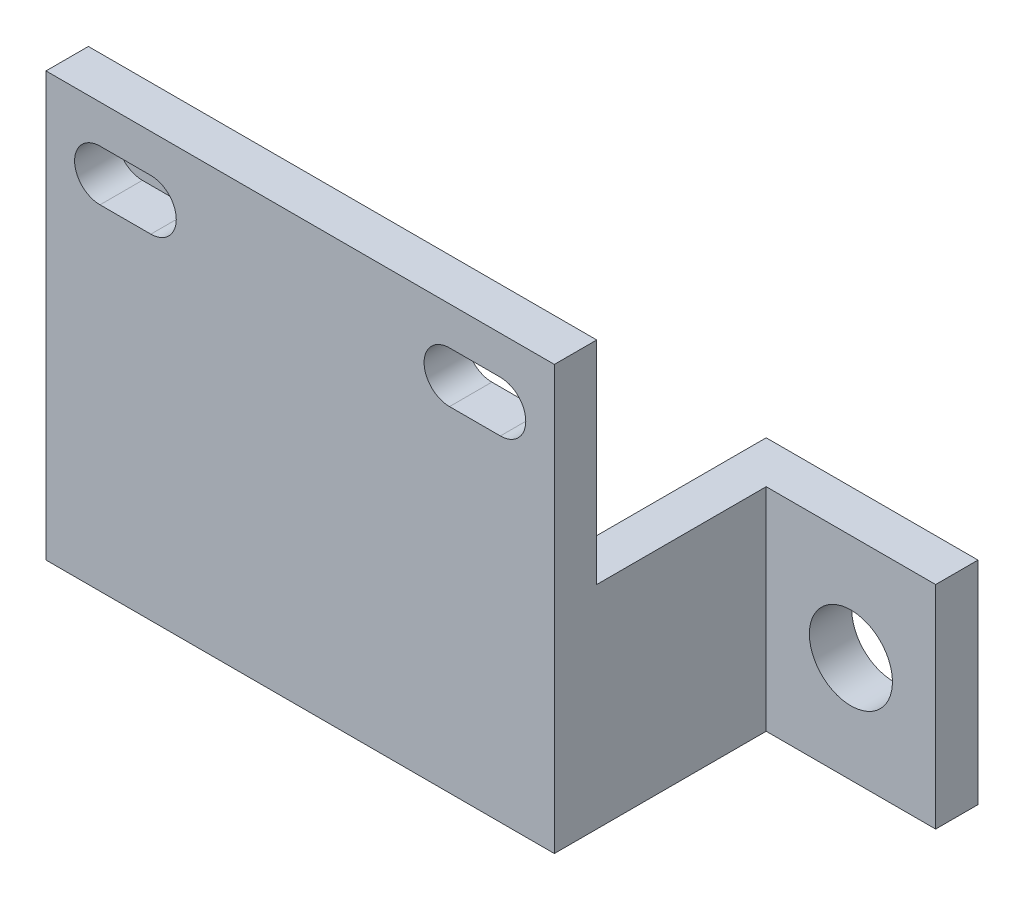
ISO-10303-21;
HEADER;
FILE_DESCRIPTION(('STEP AP214'),'2;1');
FILE_NAME('part.step','',(''),(''),'','','');
FILE_SCHEMA(('AUTOMOTIVE_DESIGN { 1 0 10303 214 1 1 1 1 }'));
ENDSEC;
DATA;
#1=APPLICATION_CONTEXT('core data for automotive mechanical design processes');
#2=APPLICATION_PROTOCOL_DEFINITION('international standard','automotive_design',2000,#1);
#3=PRODUCT_CONTEXT('',#1,'mechanical');
#4=PRODUCT('Part','Part','',(#3));
#5=PRODUCT_RELATED_PRODUCT_CATEGORY('part','',(#4));
#6=PRODUCT_DEFINITION_FORMATION('','',#4);
#7=PRODUCT_DEFINITION_CONTEXT('part definition',#1,'design');
#8=PRODUCT_DEFINITION('design','',#6,#7);
#9=PRODUCT_DEFINITION_SHAPE('','',#8);
#10=(LENGTH_UNIT() NAMED_UNIT(*) SI_UNIT(.MILLI.,.METRE.));
#11=(NAMED_UNIT(*) PLANE_ANGLE_UNIT() SI_UNIT($,.RADIAN.));
#12=(NAMED_UNIT(*) SI_UNIT($,.STERADIAN.) SOLID_ANGLE_UNIT());
#13=UNCERTAINTY_MEASURE_WITH_UNIT(LENGTH_MEASURE(1.E-05),#10,'distance_accuracy_value','');
#14=(GEOMETRIC_REPRESENTATION_CONTEXT(3) GLOBAL_UNCERTAINTY_ASSIGNED_CONTEXT((#13)) GLOBAL_UNIT_ASSIGNED_CONTEXT((#10,
#11,#12)) REPRESENTATION_CONTEXT('',''));
#15=CARTESIAN_POINT('',(0.,0.,0.));
#16=DIRECTION('',(0.,0.,1.));
#17=DIRECTION('',(1.,0.,0.));
#18=AXIS2_PLACEMENT_3D('',#15,#16,#17);
#19=CARTESIAN_POINT('',(-20.32,-6.35,2.54));
#20=DIRECTION('',(0.,0.,1.));
#21=DIRECTION('',(1.,0.,0.));
#22=AXIS2_PLACEMENT_3D('',#19,#20,#21);
#23=CYLINDRICAL_SURFACE('',#22,2.4892);
#24=CARTESIAN_POINT('',(-20.32,-6.35,2.54));
#25=DIRECTION('',(0.,0.,1.));
#26=DIRECTION('',(1.,0.,0.));
#27=AXIS2_PLACEMENT_3D('',#24,#25,#26);
#28=CIRCLE('',#27,2.4892);
#29=CARTESIAN_POINT('',(-17.8308,-6.35,2.54));
#30=VERTEX_POINT('',#29);
#31=EDGE_CURVE('E174',#30,#30,#28,.F.);
#32=ORIENTED_EDGE('',*,*,#31,.F.);
#33=EDGE_LOOP('',(#32));
#34=FACE_BOUND('',#33,.T.);
#35=CARTESIAN_POINT('',(-20.32,-6.35,0.));
#36=DIRECTION('',(0.,0.,1.));
#37=DIRECTION('',(1.,0.,0.));
#38=AXIS2_PLACEMENT_3D('',#35,#36,#37);
#39=CIRCLE('',#38,2.4892);
#40=CARTESIAN_POINT('',(-17.8308,-6.35,0.));
#41=VERTEX_POINT('',#40);
#42=EDGE_CURVE('E231',#41,#41,#39,.F.);
#43=ORIENTED_EDGE('',*,*,#42,.T.);
#44=EDGE_LOOP('',(#43));
#45=FACE_BOUND('',#44,.T.);
#46=ADVANCED_FACE('F16',(#34,#45),#23,.F.);
#47=CARTESIAN_POINT('',(20.32,-6.35,2.54));
#48=DIRECTION('',(0.,0.,-1.));
#49=DIRECTION('',(-1.,0.,0.));
#50=AXIS2_PLACEMENT_3D('',#47,#48,#49);
#51=CYLINDRICAL_SURFACE('',#50,2.4892);
#52=CARTESIAN_POINT('',(20.32,-6.35,2.54));
#53=DIRECTION('',(0.,0.,-1.));
#54=DIRECTION('',(-1.,0.,0.));
#55=AXIS2_PLACEMENT_3D('',#52,#53,#54);
#56=CIRCLE('',#55,2.4892);
#57=CARTESIAN_POINT('',(17.8308,-6.35,2.54));
#58=VERTEX_POINT('',#57);
#59=EDGE_CURVE('E226',#58,#58,#56,.F.);
#60=ORIENTED_EDGE('',*,*,#59,.T.);
#61=EDGE_LOOP('',(#60));
#62=FACE_BOUND('',#61,.T.);
#63=CARTESIAN_POINT('',(20.32,-6.35,0.));
#64=DIRECTION('',(0.,0.,-1.));
#65=DIRECTION('',(-1.,0.,0.));
#66=AXIS2_PLACEMENT_3D('',#63,#64,#65);
#67=CIRCLE('',#66,2.4892);
#68=CARTESIAN_POINT('',(17.8308,-6.35,0.));
#69=VERTEX_POINT('',#68);
#70=EDGE_CURVE('E19',#69,#69,#67,.T.);
#71=ORIENTED_EDGE('',*,*,#70,.T.);
#72=EDGE_LOOP('',(#71));
#73=FACE_BOUND('',#72,.T.);
#74=ADVANCED_FACE('F591',(#62,#73),#51,.F.);
#75=CARTESIAN_POINT('',(0.,0.,0.));
#76=DIRECTION('',(0.,1.,0.));
#77=DIRECTION('',(0.,0.,1.));
#78=AXIS2_PLACEMENT_3D('',#75,#76,#77);
#79=PLANE('',#78);
#80=DIRECTION('',(0.,0.,1.));
#81=VECTOR('',#80,1.);
#82=CARTESIAN_POINT('',(-12.7,0.,0.));
#83=LINE('',#82,#81);
#84=CARTESIAN_POINT('',(-12.7,0.,12.7));
#85=VERTEX_POINT('',#84);
#86=CARTESIAN_POINT('',(-12.7,0.,0.));
#87=VERTEX_POINT('',#86);
#88=EDGE_CURVE('E233',#85,#87,#83,.F.);
#89=ORIENTED_EDGE('',*,*,#88,.T.);
#90=DIRECTION('',(1.,0.,0.));
#91=VECTOR('',#90,1.);
#92=CARTESIAN_POINT('',(0.,0.,0.));
#93=LINE('',#92,#91);
#94=CARTESIAN_POINT('',(-25.4,0.,0.));
#95=VERTEX_POINT('',#94);
#96=EDGE_CURVE('E181',#87,#95,#93,.F.);
#97=ORIENTED_EDGE('',*,*,#96,.T.);
#98=DIRECTION('',(0.,0.,1.));
#99=VECTOR('',#98,1.);
#100=CARTESIAN_POINT('',(-25.4,0.,0.));
#101=LINE('',#100,#99);
#102=CARTESIAN_POINT('',(-25.4,0.,2.54));
#103=VERTEX_POINT('',#102);
#104=EDGE_CURVE('E178',#103,#95,#101,.F.);
#105=ORIENTED_EDGE('',*,*,#104,.F.);
#106=DIRECTION('',(1.,0.,0.));
#107=VECTOR('',#106,1.);
#108=CARTESIAN_POINT('',(0.,0.,2.54));
#109=LINE('',#108,#107);
#110=CARTESIAN_POINT('',(-15.24,0.,2.54));
#111=VERTEX_POINT('',#110);
#112=EDGE_CURVE('E164',#111,#103,#109,.F.);
#113=ORIENTED_EDGE('',*,*,#112,.F.);
#114=DIRECTION('',(0.,0.,-1.));
#115=VECTOR('',#114,1.);
#116=CARTESIAN_POINT('',(-15.24,0.,15.24));
#117=LINE('',#116,#115);
#118=CARTESIAN_POINT('',(-15.24,0.,12.7));
#119=VERTEX_POINT('',#118);
#120=EDGE_CURVE('E277',#111,#119,#117,.F.);
#121=ORIENTED_EDGE('',*,*,#120,.T.);
#122=DIRECTION('',(-1.,0.,0.));
#123=VECTOR('',#122,1.);
#124=CARTESIAN_POINT('',(0.,0.,12.7));
#125=LINE('',#124,#123);
#126=EDGE_CURVE('E271',#85,#119,#125,.T.);
#127=ORIENTED_EDGE('',*,*,#126,.F.);
#128=EDGE_LOOP('',(#89,#97,#105,#113,#121,#127));
#129=FACE_BOUND('',#128,.T.);
#130=ADVANCED_FACE('F179',(#129),#79,.T.);
#131=CARTESIAN_POINT('',(12.7,12.7,0.));
#132=DIRECTION('',(1.,0.,0.));
#133=DIRECTION('',(0.,0.,-1.));
#134=AXIS2_PLACEMENT_3D('',#131,#132,#133);
#135=PLANE('',#134);
#136=DIRECTION('',(0.,0.,-1.));
#137=VECTOR('',#136,1.);
#138=CARTESIAN_POINT('',(12.7,-12.7,0.));
#139=LINE('',#138,#137);
#140=CARTESIAN_POINT('',(12.7,-12.7,12.7));
#141=VERTEX_POINT('',#140);
#142=CARTESIAN_POINT('',(12.7,-12.7,0.));
#143=VERTEX_POINT('',#142);
#144=EDGE_CURVE('E285',#141,#143,#139,.T.);
#145=ORIENTED_EDGE('',*,*,#144,.F.);
#146=DIRECTION('',(0.,1.,0.));
#147=VECTOR('',#146,1.);
#148=CARTESIAN_POINT('',(12.7,0.,12.7));
#149=LINE('',#148,#147);
#150=CARTESIAN_POINT('',(12.7,0.,12.7));
#151=VERTEX_POINT('',#150);
#152=EDGE_CURVE('E265',#151,#141,#149,.F.);
#153=ORIENTED_EDGE('',*,*,#152,.F.);
#154=DIRECTION('',(0.,0.,1.));
#155=VECTOR('',#154,1.);
#156=CARTESIAN_POINT('',(12.7,0.,0.));
#157=LINE('',#156,#155);
#158=CARTESIAN_POINT('',(12.7,0.,0.));
#159=VERTEX_POINT('',#158);
#160=EDGE_CURVE('E229',#159,#151,#157,.T.);
#161=ORIENTED_EDGE('',*,*,#160,.F.);
#162=DIRECTION('',(0.,1.,0.));
#163=VECTOR('',#162,1.);
#164=CARTESIAN_POINT('',(12.7,0.,0.));
#165=LINE('',#164,#163);
#166=EDGE_CURVE('E194',#159,#143,#165,.F.);
#167=ORIENTED_EDGE('',*,*,#166,.T.);
#168=EDGE_LOOP('',(#145,#153,#161,#167));
#169=FACE_BOUND('',#168,.T.);
#170=ADVANCED_FACE('F572',(#169),#135,.F.);
#171=CARTESIAN_POINT('',(0.,0.,0.));
#172=DIRECTION('',(0.,0.,1.));
#173=DIRECTION('',(1.,0.,0.));
#174=AXIS2_PLACEMENT_3D('',#171,#172,#173);
#175=PLANE('',#174);
#176=ORIENTED_EDGE('',*,*,#70,.F.);
#177=EDGE_LOOP('',(#176));
#178=FACE_BOUND('',#177,.T.);
#179=DIRECTION('',(1.,0.,0.));
#180=VECTOR('',#179,1.);
#181=CARTESIAN_POINT('',(-25.4,-12.7,0.));
#182=LINE('',#181,#180);
#183=CARTESIAN_POINT('',(25.4,-12.7,0.));
#184=VERTEX_POINT('',#183);
#185=EDGE_CURVE('E288',#143,#184,#182,.T.);
#186=ORIENTED_EDGE('',*,*,#185,.F.);
#187=ORIENTED_EDGE('',*,*,#166,.F.);
#188=DIRECTION('',(1.,0.,0.));
#189=VECTOR('',#188,1.);
#190=CARTESIAN_POINT('',(0.,0.,0.));
#191=LINE('',#190,#189);
#192=CARTESIAN_POINT('',(25.4,0.,0.));
#193=VERTEX_POINT('',#192);
#194=EDGE_CURVE('E249',#193,#159,#191,.F.);
#195=ORIENTED_EDGE('',*,*,#194,.F.);
#196=DIRECTION('',(0.,1.,0.));
#197=VECTOR('',#196,1.);
#198=CARTESIAN_POINT('',(25.4,-12.7,0.));
#199=LINE('',#198,#197);
#200=EDGE_CURVE('E175',#184,#193,#199,.T.);
#201=ORIENTED_EDGE('',*,*,#200,.F.);
#202=EDGE_LOOP('',(#186,#187,#195,#201));
#203=FACE_BOUND('',#202,.T.);
#204=ADVANCED_FACE('F562',(#178,#203),#175,.F.);
#205=CARTESIAN_POINT('',(25.4,-12.7,0.));
#206=DIRECTION('',(1.,0.,0.));
#207=DIRECTION('',(0.,0.,-1.));
#208=AXIS2_PLACEMENT_3D('',#205,#206,#207);
#209=PLANE('',#208);
#210=ORIENTED_EDGE('',*,*,#200,.T.);
#211=DIRECTION('',(0.,0.,1.));
#212=VECTOR('',#211,1.);
#213=CARTESIAN_POINT('',(25.4,0.,0.));
#214=LINE('',#213,#212);
#215=CARTESIAN_POINT('',(25.4,0.,2.54));
#216=VERTEX_POINT('',#215);
#217=EDGE_CURVE('E246',#216,#193,#214,.F.);
#218=ORIENTED_EDGE('',*,*,#217,.F.);
#219=DIRECTION('',(0.,1.,0.));
#220=VECTOR('',#219,1.);
#221=CARTESIAN_POINT('',(25.4,0.,2.54));
#222=LINE('',#221,#220);
#223=CARTESIAN_POINT('',(25.4,-12.7,2.54));
#224=VERTEX_POINT('',#223);
#225=EDGE_CURVE('E230',#216,#224,#222,.F.);
#226=ORIENTED_EDGE('',*,*,#225,.T.);
#227=DIRECTION('',(0.,0.,-1.));
#228=VECTOR('',#227,1.);
#229=CARTESIAN_POINT('',(25.4,-12.7,0.));
#230=LINE('',#229,#228);
#231=EDGE_CURVE('E291',#184,#224,#230,.F.);
#232=ORIENTED_EDGE('',*,*,#231,.F.);
#233=EDGE_LOOP('',(#210,#218,#226,#232));
#234=FACE_BOUND('',#233,.T.);
#235=ADVANCED_FACE('F552',(#234),#209,.T.);
#236=CARTESIAN_POINT('',(0.,0.,2.54));
#237=DIRECTION('',(0.,0.,1.));
#238=DIRECTION('',(1.,0.,0.));
#239=AXIS2_PLACEMENT_3D('',#236,#237,#238);
#240=PLANE('',#239);
#241=ORIENTED_EDGE('',*,*,#31,.T.);
#242=EDGE_LOOP('',(#241));
#243=FACE_BOUND('',#242,.T.);
#244=DIRECTION('',(0.,1.,0.));
#245=VECTOR('',#244,1.);
#246=CARTESIAN_POINT('',(-15.24,-12.7,2.54));
#247=LINE('',#246,#245);
#248=CARTESIAN_POINT('',(-15.24,-12.7,2.54));
#249=VERTEX_POINT('',#248);
#250=EDGE_CURVE('E171',#249,#111,#247,.T.);
#251=ORIENTED_EDGE('',*,*,#250,.T.);
#252=ORIENTED_EDGE('',*,*,#112,.T.);
#253=DIRECTION('',(0.,1.,0.));
#254=VECTOR('',#253,1.);
#255=CARTESIAN_POINT('',(-25.4,12.7,2.54));
#256=LINE('',#255,#254);
#257=CARTESIAN_POINT('',(-25.4,-12.7,2.54));
#258=VERTEX_POINT('',#257);
#259=EDGE_CURVE('E169',#258,#103,#256,.T.);
#260=ORIENTED_EDGE('',*,*,#259,.F.);
#261=DIRECTION('',(1.,0.,0.));
#262=VECTOR('',#261,1.);
#263=CARTESIAN_POINT('',(-25.4,-12.7,2.54));
#264=LINE('',#263,#262);
#265=EDGE_CURVE('E299',#249,#258,#264,.F.);
#266=ORIENTED_EDGE('',*,*,#265,.F.);
#267=EDGE_LOOP('',(#251,#252,#260,#266));
#268=FACE_BOUND('',#267,.T.);
#269=ADVANCED_FACE('F166',(#243,#268),#240,.T.);
#270=CARTESIAN_POINT('',(-25.4,12.7,0.));
#271=DIRECTION('',(-1.,0.,0.));
#272=DIRECTION('',(0.,0.,1.));
#273=AXIS2_PLACEMENT_3D('',#270,#271,#272);
#274=PLANE('',#273);
#275=ORIENTED_EDGE('',*,*,#259,.T.);
#276=ORIENTED_EDGE('',*,*,#104,.T.);
#277=DIRECTION('',(0.,1.,0.));
#278=VECTOR('',#277,1.);
#279=CARTESIAN_POINT('',(-25.4,0.,0.));
#280=LINE('',#279,#278);
#281=CARTESIAN_POINT('',(-25.4,-12.7,0.));
#282=VERTEX_POINT('',#281);
#283=EDGE_CURVE('E234',#95,#282,#280,.F.);
#284=ORIENTED_EDGE('',*,*,#283,.T.);
#285=DIRECTION('',(0.,0.,-1.));
#286=VECTOR('',#285,1.);
#287=CARTESIAN_POINT('',(-25.4,-12.7,0.));
#288=LINE('',#287,#286);
#289=EDGE_CURVE('E187',#258,#282,#288,.T.);
#290=ORIENTED_EDGE('',*,*,#289,.F.);
#291=EDGE_LOOP('',(#275,#276,#284,#290));
#292=FACE_BOUND('',#291,.T.);
#293=ADVANCED_FACE('F185',(#292),#274,.T.);
#294=CARTESIAN_POINT('',(0.,0.,0.));
#295=DIRECTION('',(0.,0.,1.));
#296=DIRECTION('',(1.,0.,0.));
#297=AXIS2_PLACEMENT_3D('',#294,#295,#296);
#298=PLANE('',#297);
#299=ORIENTED_EDGE('',*,*,#42,.F.);
#300=EDGE_LOOP('',(#299));
#301=FACE_BOUND('',#300,.T.);
#302=DIRECTION('',(1.,0.,0.));
#303=VECTOR('',#302,1.);
#304=CARTESIAN_POINT('',(-25.4,-12.7,0.));
#305=LINE('',#304,#303);
#306=CARTESIAN_POINT('',(-12.7,-12.7,0.));
#307=VERTEX_POINT('',#306);
#308=EDGE_CURVE('E302',#282,#307,#305,.T.);
#309=ORIENTED_EDGE('',*,*,#308,.F.);
#310=ORIENTED_EDGE('',*,*,#283,.F.);
#311=ORIENTED_EDGE('',*,*,#96,.F.);
#312=DIRECTION('',(0.,1.,0.));
#313=VECTOR('',#312,1.);
#314=CARTESIAN_POINT('',(-12.7,-12.7,0.));
#315=LINE('',#314,#313);
#316=EDGE_CURVE('E237',#87,#307,#315,.F.);
#317=ORIENTED_EDGE('',*,*,#316,.T.);
#318=EDGE_LOOP('',(#309,#310,#311,#317));
#319=FACE_BOUND('',#318,.T.);
#320=ADVANCED_FACE('F525',(#301,#319),#298,.F.);
#321=CARTESIAN_POINT('',(-12.7,-12.7,0.));
#322=DIRECTION('',(-1.,0.,0.));
#323=DIRECTION('',(0.,0.,1.));
#324=AXIS2_PLACEMENT_3D('',#321,#322,#323);
#325=PLANE('',#324);
#326=DIRECTION('',(0.,0.,-1.));
#327=VECTOR('',#326,1.);
#328=CARTESIAN_POINT('',(-12.7,-12.7,0.));
#329=LINE('',#328,#327);
#330=CARTESIAN_POINT('',(-12.7,-12.7,12.7));
#331=VERTEX_POINT('',#330);
#332=EDGE_CURVE('E305',#307,#331,#329,.F.);
#333=ORIENTED_EDGE('',*,*,#332,.F.);
#334=ORIENTED_EDGE('',*,*,#316,.F.);
#335=ORIENTED_EDGE('',*,*,#88,.F.);
#336=DIRECTION('',(0.,1.,0.));
#337=VECTOR('',#336,1.);
#338=CARTESIAN_POINT('',(-12.7,0.,12.7));
#339=LINE('',#338,#337);
#340=EDGE_CURVE('E268',#331,#85,#339,.T.);
#341=ORIENTED_EDGE('',*,*,#340,.F.);
#342=EDGE_LOOP('',(#333,#334,#335,#341));
#343=FACE_BOUND('',#342,.T.);
#344=ADVANCED_FACE('F515',(#343),#325,.F.);
#345=CARTESIAN_POINT('',(0.,0.,2.54));
#346=DIRECTION('',(0.,0.,-1.));
#347=DIRECTION('',(-1.,0.,0.));
#348=AXIS2_PLACEMENT_3D('',#345,#346,#347);
#349=PLANE('',#348);
#350=ORIENTED_EDGE('',*,*,#59,.F.);
#351=EDGE_LOOP('',(#350));
#352=FACE_BOUND('',#351,.T.);
#353=DIRECTION('',(1.,0.,0.));
#354=VECTOR('',#353,1.);
#355=CARTESIAN_POINT('',(-25.4,-12.7,2.54));
#356=LINE('',#355,#354);
#357=CARTESIAN_POINT('',(15.24,-12.7,2.54));
#358=VERTEX_POINT('',#357);
#359=EDGE_CURVE('E294',#224,#358,#356,.F.);
#360=ORIENTED_EDGE('',*,*,#359,.F.);
#361=ORIENTED_EDGE('',*,*,#225,.F.);
#362=DIRECTION('',(1.,0.,0.));
#363=VECTOR('',#362,1.);
#364=CARTESIAN_POINT('',(0.,0.,2.54));
#365=LINE('',#364,#363);
#366=CARTESIAN_POINT('',(15.24,0.,2.54));
#367=VERTEX_POINT('',#366);
#368=EDGE_CURVE('E91',#367,#216,#365,.T.);
#369=ORIENTED_EDGE('',*,*,#368,.F.);
#370=DIRECTION('',(0.,1.,0.));
#371=VECTOR('',#370,1.);
#372=CARTESIAN_POINT('',(15.24,-12.7,2.54));
#373=LINE('',#372,#371);
#374=EDGE_CURVE('E320',#358,#367,#373,.T.);
#375=ORIENTED_EDGE('',*,*,#374,.F.);
#376=EDGE_LOOP('',(#360,#361,#369,#375));
#377=FACE_BOUND('',#376,.T.);
#378=ADVANCED_FACE('F505',(#352,#377),#349,.F.);
#379=CARTESIAN_POINT('',(0.,0.,0.));
#380=DIRECTION('',(0.,1.,0.));
#381=DIRECTION('',(0.,0.,1.));
#382=AXIS2_PLACEMENT_3D('',#379,#380,#381);
#383=PLANE('',#382);
#384=ORIENTED_EDGE('',*,*,#217,.T.);
#385=ORIENTED_EDGE('',*,*,#194,.T.);
#386=ORIENTED_EDGE('',*,*,#160,.T.);
#387=DIRECTION('',(-1.,0.,0.));
#388=VECTOR('',#387,1.);
#389=CARTESIAN_POINT('',(0.,0.,12.7));
#390=LINE('',#389,#388);
#391=CARTESIAN_POINT('',(15.24,0.,12.7));
#392=VERTEX_POINT('',#391);
#393=EDGE_CURVE('E252',#392,#151,#390,.T.);
#394=ORIENTED_EDGE('',*,*,#393,.F.);
#395=DIRECTION('',(0.,0.,-1.));
#396=VECTOR('',#395,1.);
#397=CARTESIAN_POINT('',(15.24,0.,15.24));
#398=LINE('',#397,#396);
#399=EDGE_CURVE('E225',#367,#392,#398,.F.);
#400=ORIENTED_EDGE('',*,*,#399,.F.);
#401=ORIENTED_EDGE('',*,*,#368,.T.);
#402=EDGE_LOOP('',(#384,#385,#386,#394,#400,#401));
#403=FACE_BOUND('',#402,.T.);
#404=ADVANCED_FACE('F495',(#403),#383,.T.);
#405=CARTESIAN_POINT('',(0.,0.,12.7));
#406=DIRECTION('',(0.,0.,-1.));
#407=DIRECTION('',(-1.,0.,0.));
#408=AXIS2_PLACEMENT_3D('',#405,#406,#407);
#409=PLANE('',#408);
#410=DIRECTION('',(1.,0.,0.));
#411=VECTOR('',#410,1.);
#412=CARTESIAN_POINT('',(10.4775,7.366,12.7));
#413=LINE('',#412,#411);
#414=CARTESIAN_POINT('',(12.0015,7.366,12.7));
#415=VERTEX_POINT('',#414);
#416=CARTESIAN_POINT('',(8.9535,7.366,12.7));
#417=VERTEX_POINT('',#416);
#418=EDGE_CURVE('E259',#415,#417,#413,.F.);
#419=ORIENTED_EDGE('',*,*,#418,.F.);
#420=CARTESIAN_POINT('',(12.0015,8.89,12.7));
#421=DIRECTION('',(0.,0.,-1.));
#422=DIRECTION('',(-1.,0.,0.));
#423=AXIS2_PLACEMENT_3D('',#420,#421,#422);
#424=CIRCLE('',#423,1.524);
#425=CARTESIAN_POINT('',(12.0015,10.414,12.7));
#426=VERTEX_POINT('',#425);
#427=EDGE_CURVE('E211',#415,#426,#424,.F.);
#428=ORIENTED_EDGE('',*,*,#427,.T.);
#429=DIRECTION('',(1.,0.,0.));
#430=VECTOR('',#429,1.);
#431=CARTESIAN_POINT('',(8.9535,10.414,12.7));
#432=LINE('',#431,#430);
#433=CARTESIAN_POINT('',(8.9535,10.414,12.7));
#434=VERTEX_POINT('',#433);
#435=EDGE_CURVE('E214',#434,#426,#432,.T.);
#436=ORIENTED_EDGE('',*,*,#435,.F.);
#437=CARTESIAN_POINT('',(8.9535,8.89,12.7));
#438=DIRECTION('',(0.,0.,-1.));
#439=DIRECTION('',(-1.,0.,0.));
#440=AXIS2_PLACEMENT_3D('',#437,#438,#439);
#441=CIRCLE('',#440,1.524);
#442=EDGE_CURVE('E215',#434,#417,#441,.F.);
#443=ORIENTED_EDGE('',*,*,#442,.T.);
#444=EDGE_LOOP('',(#419,#428,#436,#443));
#445=FACE_BOUND('',#444,.T.);
#446=DIRECTION('',(1.,0.,0.));
#447=VECTOR('',#446,1.);
#448=CARTESIAN_POINT('',(-8.9535,10.414,12.7));
#449=LINE('',#448,#447);
#450=CARTESIAN_POINT('',(-8.9535,10.414,12.7));
#451=VERTEX_POINT('',#450);
#452=CARTESIAN_POINT('',(-12.0015,10.414,12.7));
#453=VERTEX_POINT('',#452);
#454=EDGE_CURVE('E82',#451,#453,#449,.F.);
#455=ORIENTED_EDGE('',*,*,#454,.T.);
#456=CARTESIAN_POINT('',(-12.0015,8.89,12.7));
#457=DIRECTION('',(0.,0.,1.));
#458=DIRECTION('',(1.,0.,0.));
#459=AXIS2_PLACEMENT_3D('',#456,#457,#458);
#460=CIRCLE('',#459,1.524);
#461=CARTESIAN_POINT('',(-12.0015,7.366,12.7));
#462=VERTEX_POINT('',#461);
#463=EDGE_CURVE('E223',#453,#462,#460,.T.);
#464=ORIENTED_EDGE('',*,*,#463,.T.);
#465=DIRECTION('',(1.,0.,0.));
#466=VECTOR('',#465,1.);
#467=CARTESIAN_POINT('',(-10.4775,7.366,12.7));
#468=LINE('',#467,#466);
#469=CARTESIAN_POINT('',(-8.9535,7.366,12.7));
#470=VERTEX_POINT('',#469);
#471=EDGE_CURVE('E254',#462,#470,#468,.T.);
#472=ORIENTED_EDGE('',*,*,#471,.T.);
#473=CARTESIAN_POINT('',(-8.9535,8.89,12.7));
#474=DIRECTION('',(0.,0.,1.));
#475=DIRECTION('',(1.,0.,0.));
#476=AXIS2_PLACEMENT_3D('',#473,#474,#475);
#477=CIRCLE('',#476,1.524);
#478=EDGE_CURVE('E219',#470,#451,#477,.T.);
#479=ORIENTED_EDGE('',*,*,#478,.T.);
#480=EDGE_LOOP('',(#455,#464,#472,#479));
#481=FACE_BOUND('',#480,.T.);
#482=DIRECTION('',(0.,1.,0.));
#483=VECTOR('',#482,1.);
#484=CARTESIAN_POINT('',(-15.24,-12.7,12.7));
#485=LINE('',#484,#483);
#486=CARTESIAN_POINT('',(-15.24,12.7,12.7));
#487=VERTEX_POINT('',#486);
#488=EDGE_CURVE('E279',#119,#487,#485,.T.);
#489=ORIENTED_EDGE('',*,*,#488,.T.);
#490=DIRECTION('',(1.,0.,0.));
#491=VECTOR('',#490,1.);
#492=CARTESIAN_POINT('',(25.4,12.7,12.7));
#493=LINE('',#492,#491);
#494=CARTESIAN_POINT('',(15.24,12.7,12.7));
#495=VERTEX_POINT('',#494);
#496=EDGE_CURVE('E274',#495,#487,#493,.F.);
#497=ORIENTED_EDGE('',*,*,#496,.F.);
#498=DIRECTION('',(0.,1.,0.));
#499=VECTOR('',#498,1.);
#500=CARTESIAN_POINT('',(15.24,-12.7,12.7));
#501=LINE('',#500,#499);
#502=EDGE_CURVE('E311',#392,#495,#501,.T.);
#503=ORIENTED_EDGE('',*,*,#502,.F.);
#504=ORIENTED_EDGE('',*,*,#393,.T.);
#505=ORIENTED_EDGE('',*,*,#152,.T.);
#506=DIRECTION('',(1.,0.,0.));
#507=VECTOR('',#506,1.);
#508=CARTESIAN_POINT('',(-25.4,-12.7,12.7));
#509=LINE('',#508,#507);
#510=EDGE_CURVE('E308',#331,#141,#509,.T.);
#511=ORIENTED_EDGE('',*,*,#510,.F.);
#512=ORIENTED_EDGE('',*,*,#340,.T.);
#513=ORIENTED_EDGE('',*,*,#126,.T.);
#514=EDGE_LOOP('',(#489,#497,#503,#504,#505,#511,#512,#513));
#515=FACE_BOUND('',#514,.T.);
#516=ADVANCED_FACE('F485',(#445,#481,#515),#409,.T.);
#517=CARTESIAN_POINT('',(25.4,12.7,0.));
#518=DIRECTION('',(0.,1.,0.));
#519=DIRECTION('',(0.,0.,1.));
#520=AXIS2_PLACEMENT_3D('',#517,#518,#519);
#521=PLANE('',#520);
#522=DIRECTION('',(0.,0.,-1.));
#523=VECTOR('',#522,1.);
#524=CARTESIAN_POINT('',(15.24,12.7,15.24));
#525=LINE('',#524,#523);
#526=CARTESIAN_POINT('',(15.24,12.7,15.24));
#527=VERTEX_POINT('',#526);
#528=EDGE_CURVE('E314',#495,#527,#525,.F.);
#529=ORIENTED_EDGE('',*,*,#528,.F.);
#530=ORIENTED_EDGE('',*,*,#496,.T.);
#531=DIRECTION('',(0.,0.,-1.));
#532=VECTOR('',#531,1.);
#533=CARTESIAN_POINT('',(-15.24,12.7,15.24));
#534=LINE('',#533,#532);
#535=CARTESIAN_POINT('',(-15.24,12.7,15.24));
#536=VERTEX_POINT('',#535);
#537=EDGE_CURVE('E281',#487,#536,#534,.F.);
#538=ORIENTED_EDGE('',*,*,#537,.T.);
#539=DIRECTION('',(1.,0.,0.));
#540=VECTOR('',#539,1.);
#541=CARTESIAN_POINT('',(0.,12.7,15.24));
#542=LINE('',#541,#540);
#543=EDGE_CURVE('E262',#527,#536,#542,.F.);
#544=ORIENTED_EDGE('',*,*,#543,.F.);
#545=EDGE_LOOP('',(#529,#530,#538,#544));
#546=FACE_BOUND('',#545,.T.);
#547=ADVANCED_FACE('F475',(#546),#521,.T.);
#548=CARTESIAN_POINT('',(-15.24,-12.7,15.24));
#549=DIRECTION('',(1.,0.,0.));
#550=DIRECTION('',(0.,0.,-1.));
#551=AXIS2_PLACEMENT_3D('',#548,#549,#550);
#552=PLANE('',#551);
#553=DIRECTION('',(0.,0.,-1.));
#554=VECTOR('',#553,1.);
#555=CARTESIAN_POINT('',(-15.24,-12.7,0.));
#556=LINE('',#555,#554);
#557=CARTESIAN_POINT('',(-15.24,-12.7,15.24));
#558=VERTEX_POINT('',#557);
#559=EDGE_CURVE('E296',#558,#249,#556,.T.);
#560=ORIENTED_EDGE('',*,*,#559,.F.);
#561=DIRECTION('',(0.,1.,0.));
#562=VECTOR('',#561,1.);
#563=CARTESIAN_POINT('',(-15.24,0.,15.24));
#564=LINE('',#563,#562);
#565=EDGE_CURVE('E339',#536,#558,#564,.F.);
#566=ORIENTED_EDGE('',*,*,#565,.F.);
#567=ORIENTED_EDGE('',*,*,#537,.F.);
#568=ORIENTED_EDGE('',*,*,#488,.F.);
#569=ORIENTED_EDGE('',*,*,#120,.F.);
#570=ORIENTED_EDGE('',*,*,#250,.F.);
#571=EDGE_LOOP('',(#560,#566,#567,#568,#569,#570));
#572=FACE_BOUND('',#571,.T.);
#573=ADVANCED_FACE('F465',(#572),#552,.F.);
#574=CARTESIAN_POINT('',(-25.4,-12.7,0.));
#575=DIRECTION('',(0.,-1.,0.));
#576=DIRECTION('',(0.,0.,-1.));
#577=AXIS2_PLACEMENT_3D('',#574,#575,#576);
#578=PLANE('',#577);
#579=ORIENTED_EDGE('',*,*,#332,.T.);
#580=ORIENTED_EDGE('',*,*,#510,.T.);
#581=ORIENTED_EDGE('',*,*,#144,.T.);
#582=ORIENTED_EDGE('',*,*,#185,.T.);
#583=ORIENTED_EDGE('',*,*,#231,.T.);
#584=ORIENTED_EDGE('',*,*,#359,.T.);
#585=DIRECTION('',(0.,0.,-1.));
#586=VECTOR('',#585,1.);
#587=CARTESIAN_POINT('',(15.24,-12.7,15.24));
#588=LINE('',#587,#586);
#589=CARTESIAN_POINT('',(15.24,-12.7,15.24));
#590=VERTEX_POINT('',#589);
#591=EDGE_CURVE('E317',#590,#358,#588,.T.);
#592=ORIENTED_EDGE('',*,*,#591,.F.);
#593=DIRECTION('',(1.,0.,0.));
#594=VECTOR('',#593,1.);
#595=CARTESIAN_POINT('',(0.,-12.7,15.24));
#596=LINE('',#595,#594);
#597=EDGE_CURVE('E342',#558,#590,#596,.T.);
#598=ORIENTED_EDGE('',*,*,#597,.F.);
#599=ORIENTED_EDGE('',*,*,#559,.T.);
#600=ORIENTED_EDGE('',*,*,#265,.T.);
#601=ORIENTED_EDGE('',*,*,#289,.T.);
#602=ORIENTED_EDGE('',*,*,#308,.T.);
#603=EDGE_LOOP('',(#579,#580,#581,#582,#583,#584,#592,#598,#599,#600,#601,#602));
#604=FACE_BOUND('',#603,.T.);
#605=ADVANCED_FACE('F455',(#604),#578,.T.);
#606=CARTESIAN_POINT('',(15.24,-12.7,15.24));
#607=DIRECTION('',(1.,0.,0.));
#608=DIRECTION('',(0.,0.,-1.));
#609=AXIS2_PLACEMENT_3D('',#606,#607,#608);
#610=PLANE('',#609);
#611=ORIENTED_EDGE('',*,*,#374,.T.);
#612=ORIENTED_EDGE('',*,*,#399,.T.);
#613=ORIENTED_EDGE('',*,*,#502,.T.);
#614=ORIENTED_EDGE('',*,*,#528,.T.);
#615=DIRECTION('',(0.,1.,0.));
#616=VECTOR('',#615,1.);
#617=CARTESIAN_POINT('',(15.24,0.,15.24));
#618=LINE('',#617,#616);
#619=EDGE_CURVE('E210',#590,#527,#618,.T.);
#620=ORIENTED_EDGE('',*,*,#619,.F.);
#621=ORIENTED_EDGE('',*,*,#591,.T.);
#622=EDGE_LOOP('',(#611,#612,#613,#614,#620,#621));
#623=FACE_BOUND('',#622,.T.);
#624=ADVANCED_FACE('F445',(#623),#610,.T.);
#625=CARTESIAN_POINT('',(-12.0015,8.89,15.24));
#626=DIRECTION('',(0.,0.,1.));
#627=DIRECTION('',(1.,0.,0.));
#628=AXIS2_PLACEMENT_3D('',#625,#626,#627);
#629=CYLINDRICAL_SURFACE('',#628,1.524);
#630=CARTESIAN_POINT('',(-12.0015,8.89,15.24));
#631=DIRECTION('',(0.,0.,1.));
#632=DIRECTION('',(1.,0.,0.));
#633=AXIS2_PLACEMENT_3D('',#630,#631,#632);
#634=CIRCLE('',#633,1.524);
#635=CARTESIAN_POINT('',(-12.0015,7.366,15.24));
#636=VERTEX_POINT('',#635);
#637=CARTESIAN_POINT('',(-12.0015,10.414,15.24));
#638=VERTEX_POINT('',#637);
#639=EDGE_CURVE('E207',#636,#638,#634,.F.);
#640=ORIENTED_EDGE('',*,*,#639,.F.);
#641=DIRECTION('',(0.,0.,-1.));
#642=VECTOR('',#641,1.);
#643=CARTESIAN_POINT('',(-12.0015,7.366,15.24));
#644=LINE('',#643,#642);
#645=EDGE_CURVE('E218',#636,#462,#644,.T.);
#646=ORIENTED_EDGE('',*,*,#645,.T.);
#647=ORIENTED_EDGE('',*,*,#463,.F.);
#648=DIRECTION('',(0.,0.,1.));
#649=VECTOR('',#648,1.);
#650=CARTESIAN_POINT('',(-12.0015,10.414,15.24));
#651=LINE('',#650,#649);
#652=EDGE_CURVE('E222',#453,#638,#651,.T.);
#653=ORIENTED_EDGE('',*,*,#652,.T.);
#654=EDGE_LOOP('',(#640,#646,#647,#653));
#655=FACE_BOUND('',#654,.T.);
#656=ADVANCED_FACE('F435',(#655),#629,.F.);
#657=CARTESIAN_POINT('',(-8.9535,10.414,15.24));
#658=DIRECTION('',(0.,1.,0.));
#659=DIRECTION('',(0.,0.,1.));
#660=AXIS2_PLACEMENT_3D('',#657,#658,#659);
#661=PLANE('',#660);
#662=DIRECTION('',(1.,0.,0.));
#663=VECTOR('',#662,1.);
#664=CARTESIAN_POINT('',(0.,10.414,15.24));
#665=LINE('',#664,#663);
#666=CARTESIAN_POINT('',(-8.9535,10.414,15.24));
#667=VERTEX_POINT('',#666);
#668=EDGE_CURVE('E206',#638,#667,#665,.T.);
#669=ORIENTED_EDGE('',*,*,#668,.F.);
#670=ORIENTED_EDGE('',*,*,#652,.F.);
#671=ORIENTED_EDGE('',*,*,#454,.F.);
#672=DIRECTION('',(0.,0.,1.));
#673=VECTOR('',#672,1.);
#674=CARTESIAN_POINT('',(-8.9535,10.414,15.24));
#675=LINE('',#674,#673);
#676=EDGE_CURVE('E221',#451,#667,#675,.T.);
#677=ORIENTED_EDGE('',*,*,#676,.T.);
#678=EDGE_LOOP('',(#669,#670,#671,#677));
#679=FACE_BOUND('',#678,.T.);
#680=ADVANCED_FACE('F425',(#679),#661,.F.);
#681=CARTESIAN_POINT('',(-8.9535,8.89,15.24));
#682=DIRECTION('',(0.,0.,1.));
#683=DIRECTION('',(1.,0.,0.));
#684=AXIS2_PLACEMENT_3D('',#681,#682,#683);
#685=CYLINDRICAL_SURFACE('',#684,1.524);
#686=CARTESIAN_POINT('',(-8.9535,8.89,15.24));
#687=DIRECTION('',(0.,0.,1.));
#688=DIRECTION('',(1.,0.,0.));
#689=AXIS2_PLACEMENT_3D('',#686,#687,#688);
#690=CIRCLE('',#689,1.524);
#691=CARTESIAN_POINT('',(-8.9535,7.366,15.24));
#692=VERTEX_POINT('',#691);
#693=EDGE_CURVE('E203',#667,#692,#690,.F.);
#694=ORIENTED_EDGE('',*,*,#693,.F.);
#695=ORIENTED_EDGE('',*,*,#676,.F.);
#696=ORIENTED_EDGE('',*,*,#478,.F.);
#697=DIRECTION('',(0.,0.,-1.));
#698=VECTOR('',#697,1.);
#699=CARTESIAN_POINT('',(-8.9535,7.366,15.24));
#700=LINE('',#699,#698);
#701=EDGE_CURVE('E256',#470,#692,#700,.F.);
#702=ORIENTED_EDGE('',*,*,#701,.T.);
#703=EDGE_LOOP('',(#694,#695,#696,#702));
#704=FACE_BOUND('',#703,.T.);
#705=ADVANCED_FACE('F415',(#704),#685,.F.);
#706=CARTESIAN_POINT('',(-10.4775,7.366,15.24));
#707=DIRECTION('',(0.,-1.,0.));
#708=DIRECTION('',(0.,0.,-1.));
#709=AXIS2_PLACEMENT_3D('',#706,#707,#708);
#710=PLANE('',#709);
#711=DIRECTION('',(1.,0.,0.));
#712=VECTOR('',#711,1.);
#713=CARTESIAN_POINT('',(0.,7.366,15.24));
#714=LINE('',#713,#712);
#715=EDGE_CURVE('E202',#692,#636,#714,.F.);
#716=ORIENTED_EDGE('',*,*,#715,.F.);
#717=ORIENTED_EDGE('',*,*,#701,.F.);
#718=ORIENTED_EDGE('',*,*,#471,.F.);
#719=ORIENTED_EDGE('',*,*,#645,.F.);
#720=EDGE_LOOP('',(#716,#717,#718,#719));
#721=FACE_BOUND('',#720,.T.);
#722=ADVANCED_FACE('F405',(#721),#710,.F.);
#723=CARTESIAN_POINT('',(8.9535,8.89,15.24));
#724=DIRECTION('',(0.,0.,-1.));
#725=DIRECTION('',(-1.,0.,0.));
#726=AXIS2_PLACEMENT_3D('',#723,#724,#725);
#727=CYLINDRICAL_SURFACE('',#726,1.524);
#728=CARTESIAN_POINT('',(8.9535,8.89,15.24));
#729=DIRECTION('',(0.,0.,-1.));
#730=DIRECTION('',(-1.,0.,0.));
#731=AXIS2_PLACEMENT_3D('',#728,#729,#730);
#732=CIRCLE('',#731,1.524);
#733=CARTESIAN_POINT('',(8.9535,7.366,15.24));
#734=VERTEX_POINT('',#733);
#735=CARTESIAN_POINT('',(8.9535,10.414,15.24));
#736=VERTEX_POINT('',#735);
#737=EDGE_CURVE('E199',#734,#736,#732,.T.);
#738=ORIENTED_EDGE('',*,*,#737,.F.);
#739=DIRECTION('',(0.,0.,1.));
#740=VECTOR('',#739,1.);
#741=CARTESIAN_POINT('',(8.9535,7.366,15.24));
#742=LINE('',#741,#740);
#743=EDGE_CURVE('E333',#417,#734,#742,.T.);
#744=ORIENTED_EDGE('',*,*,#743,.F.);
#745=ORIENTED_EDGE('',*,*,#442,.F.);
#746=DIRECTION('',(0.,0.,-1.));
#747=VECTOR('',#746,1.);
#748=CARTESIAN_POINT('',(8.9535,10.414,15.24));
#749=LINE('',#748,#747);
#750=EDGE_CURVE('E217',#736,#434,#749,.T.);
#751=ORIENTED_EDGE('',*,*,#750,.F.);
#752=EDGE_LOOP('',(#738,#744,#745,#751));
#753=FACE_BOUND('',#752,.T.);
#754=ADVANCED_FACE('F371',(#753),#727,.F.);
#755=CARTESIAN_POINT('',(8.9535,10.414,15.24));
#756=DIRECTION('',(0.,-1.,0.));
#757=DIRECTION('',(0.,0.,-1.));
#758=AXIS2_PLACEMENT_3D('',#755,#756,#757);
#759=PLANE('',#758);
#760=ORIENTED_EDGE('',*,*,#750,.T.);
#761=ORIENTED_EDGE('',*,*,#435,.T.);
#762=DIRECTION('',(0.,0.,-1.));
#763=VECTOR('',#762,1.);
#764=CARTESIAN_POINT('',(12.0015,10.414,15.24));
#765=LINE('',#764,#763);
#766=CARTESIAN_POINT('',(12.0015,10.414,15.24));
#767=VERTEX_POINT('',#766);
#768=EDGE_CURVE('E213',#426,#767,#765,.F.);
#769=ORIENTED_EDGE('',*,*,#768,.T.);
#770=DIRECTION('',(1.,0.,0.));
#771=VECTOR('',#770,1.);
#772=CARTESIAN_POINT('',(0.,10.414,15.24));
#773=LINE('',#772,#771);
#774=EDGE_CURVE('E198',#736,#767,#773,.T.);
#775=ORIENTED_EDGE('',*,*,#774,.F.);
#776=EDGE_LOOP('',(#760,#761,#769,#775));
#777=FACE_BOUND('',#776,.T.);
#778=ADVANCED_FACE('F357',(#777),#759,.T.);
#779=CARTESIAN_POINT('',(12.0015,8.89,15.24));
#780=DIRECTION('',(0.,0.,-1.));
#781=DIRECTION('',(-1.,0.,0.));
#782=AXIS2_PLACEMENT_3D('',#779,#780,#781);
#783=CYLINDRICAL_SURFACE('',#782,1.524);
#784=CARTESIAN_POINT('',(12.0015,8.89,15.24));
#785=DIRECTION('',(0.,0.,-1.));
#786=DIRECTION('',(-1.,0.,0.));
#787=AXIS2_PLACEMENT_3D('',#784,#785,#786);
#788=CIRCLE('',#787,1.524);
#789=CARTESIAN_POINT('',(12.0015,7.366,15.24));
#790=VERTEX_POINT('',#789);
#791=EDGE_CURVE('E25',#767,#790,#788,.T.);
#792=ORIENTED_EDGE('',*,*,#791,.F.);
#793=ORIENTED_EDGE('',*,*,#768,.F.);
#794=ORIENTED_EDGE('',*,*,#427,.F.);
#795=DIRECTION('',(0.,0.,1.));
#796=VECTOR('',#795,1.);
#797=CARTESIAN_POINT('',(12.0015,7.366,15.24));
#798=LINE('',#797,#796);
#799=EDGE_CURVE('E34',#790,#415,#798,.F.);
#800=ORIENTED_EDGE('',*,*,#799,.F.);
#801=EDGE_LOOP('',(#792,#793,#794,#800));
#802=FACE_BOUND('',#801,.T.);
#803=ADVANCED_FACE('F360',(#802),#783,.F.);
#804=CARTESIAN_POINT('',(10.4775,7.366,15.24));
#805=DIRECTION('',(0.,1.,0.));
#806=DIRECTION('',(0.,0.,1.));
#807=AXIS2_PLACEMENT_3D('',#804,#805,#806);
#808=PLANE('',#807);
#809=ORIENTED_EDGE('',*,*,#799,.T.);
#810=ORIENTED_EDGE('',*,*,#418,.T.);
#811=ORIENTED_EDGE('',*,*,#743,.T.);
#812=DIRECTION('',(1.,0.,0.));
#813=VECTOR('',#812,1.);
#814=CARTESIAN_POINT('',(0.,7.366,15.24));
#815=LINE('',#814,#813);
#816=EDGE_CURVE('E11',#790,#734,#815,.F.);
#817=ORIENTED_EDGE('',*,*,#816,.F.);
#818=EDGE_LOOP('',(#809,#810,#811,#817));
#819=FACE_BOUND('',#818,.T.);
#820=ADVANCED_FACE('F362',(#819),#808,.T.);
#821=CARTESIAN_POINT('',(0.,0.,15.24));
#822=DIRECTION('',(0.,0.,1.));
#823=DIRECTION('',(1.,0.,0.));
#824=AXIS2_PLACEMENT_3D('',#821,#822,#823);
#825=PLANE('',#824);
#826=ORIENTED_EDGE('',*,*,#791,.T.);
#827=ORIENTED_EDGE('',*,*,#816,.T.);
#828=ORIENTED_EDGE('',*,*,#737,.T.);
#829=ORIENTED_EDGE('',*,*,#774,.T.);
#830=EDGE_LOOP('',(#826,#827,#828,#829));
#831=FACE_BOUND('',#830,.T.);
#832=ORIENTED_EDGE('',*,*,#693,.T.);
#833=ORIENTED_EDGE('',*,*,#715,.T.);
#834=ORIENTED_EDGE('',*,*,#639,.T.);
#835=ORIENTED_EDGE('',*,*,#668,.T.);
#836=EDGE_LOOP('',(#832,#833,#834,#835));
#837=FACE_BOUND('',#836,.T.);
#838=ORIENTED_EDGE('',*,*,#597,.T.);
#839=ORIENTED_EDGE('',*,*,#619,.T.);
#840=ORIENTED_EDGE('',*,*,#543,.T.);
#841=ORIENTED_EDGE('',*,*,#565,.T.);
#842=EDGE_LOOP('',(#838,#839,#840,#841));
#843=FACE_BOUND('',#842,.T.);
#844=ADVANCED_FACE('F354',(#831,#837,#843),#825,.T.);
#845=CLOSED_SHELL('',(#46,#74,#130,#170,#204,#235,#269,#293,#320,#344,#378,#404,#516,#547,#573,
#605,#624,#656,#680,#705,#722,#754,#778,#803,#820,#844));
#846=MANIFOLD_SOLID_BREP('B1',#845);
#847=ADVANCED_BREP_SHAPE_REPRESENTATION('',(#18,#846),#14);
#848=SHAPE_DEFINITION_REPRESENTATION(#9,#847);
ENDSEC;
END-ISO-10303-21;
